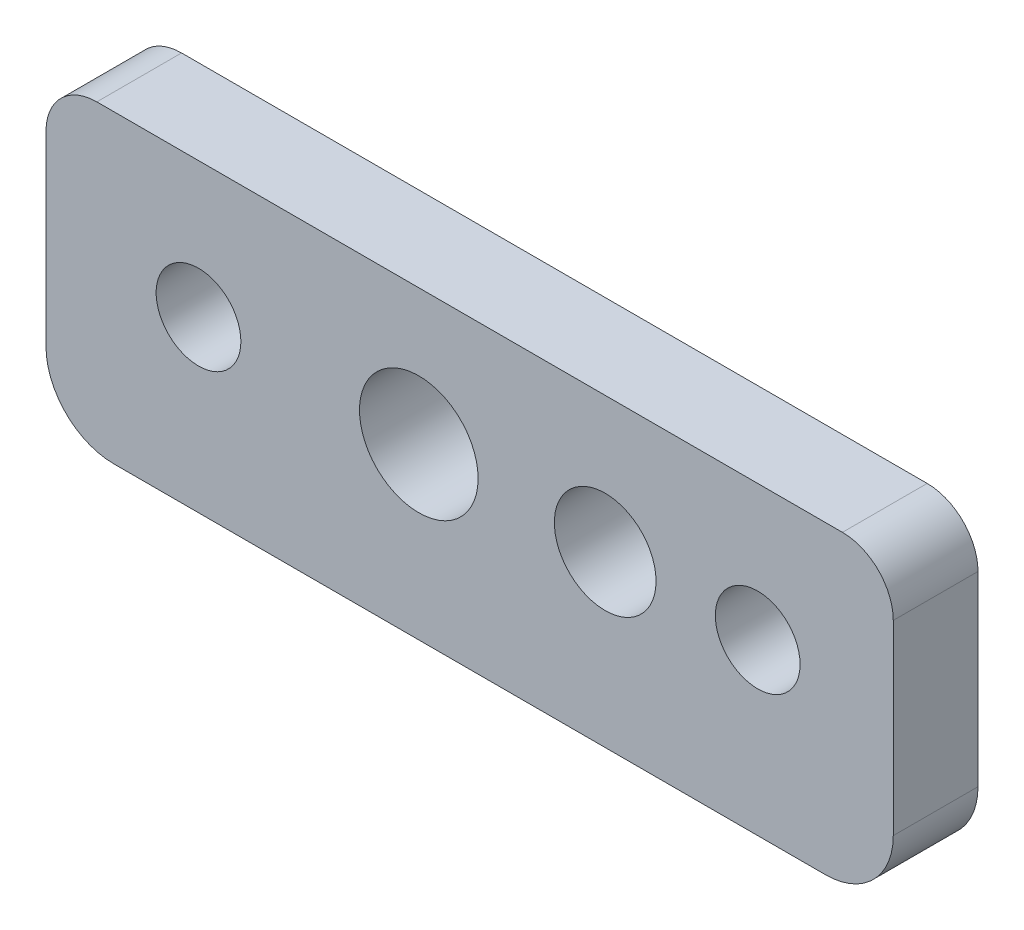
ISO-10303-21;
HEADER;
FILE_DESCRIPTION(('STEP AP214'),'2;1');
FILE_NAME('part.step','',(''),(''),'','','');
FILE_SCHEMA(('AUTOMOTIVE_DESIGN { 1 0 10303 214 1 1 1 1 }'));
ENDSEC;
DATA;
#1=APPLICATION_CONTEXT('core data for automotive mechanical design processes');
#2=APPLICATION_PROTOCOL_DEFINITION('international standard','automotive_design',2000,#1);
#3=PRODUCT_CONTEXT('',#1,'mechanical');
#4=PRODUCT('Part','Part','',(#3));
#5=PRODUCT_RELATED_PRODUCT_CATEGORY('part','',(#4));
#6=PRODUCT_DEFINITION_FORMATION('','',#4);
#7=PRODUCT_DEFINITION_CONTEXT('part definition',#1,'design');
#8=PRODUCT_DEFINITION('design','',#6,#7);
#9=PRODUCT_DEFINITION_SHAPE('','',#8);
#10=(LENGTH_UNIT() NAMED_UNIT(*) SI_UNIT(.MILLI.,.METRE.));
#11=(NAMED_UNIT(*) PLANE_ANGLE_UNIT() SI_UNIT($,.RADIAN.));
#12=(NAMED_UNIT(*) SI_UNIT($,.STERADIAN.) SOLID_ANGLE_UNIT());
#13=UNCERTAINTY_MEASURE_WITH_UNIT(LENGTH_MEASURE(1.E-05),#10,'distance_accuracy_value','');
#14=(GEOMETRIC_REPRESENTATION_CONTEXT(3) GLOBAL_UNCERTAINTY_ASSIGNED_CONTEXT((#13)) GLOBAL_UNIT_ASSIGNED_CONTEXT((#10,
#11,#12)) REPRESENTATION_CONTEXT('',''));
#15=CARTESIAN_POINT('',(0.,0.,0.));
#16=DIRECTION('',(0.,0.,1.));
#17=DIRECTION('',(1.,0.,0.));
#18=AXIS2_PLACEMENT_3D('',#15,#16,#17);
#19=CARTESIAN_POINT('',(0.,0.,25.));
#20=DIRECTION('',(-1.,0.,0.));
#21=DIRECTION('',(0.,0.,1.));
#22=AXIS2_PLACEMENT_3D('',#19,#20,#21);
#23=PLANE('',#22);
#24=DIRECTION('',(0.,1.,0.));
#25=VECTOR('',#24,1.);
#26=CARTESIAN_POINT('',(0.,0.,0.));
#27=LINE('',#26,#25);
#28=CARTESIAN_POINT('',(0.,-70.,0.));
#29=VERTEX_POINT('',#28);
#30=CARTESIAN_POINT('',(0.,-15.,0.));
#31=VERTEX_POINT('',#30);
#32=EDGE_CURVE('E112',#29,#31,#27,.T.);
#33=ORIENTED_EDGE('',*,*,#32,.F.);
#34=DIRECTION('',(0.,0.,-1.));
#35=VECTOR('',#34,1.);
#36=CARTESIAN_POINT('',(0.,-70.,25.));
#37=LINE('',#36,#35);
#38=CARTESIAN_POINT('',(0.,-70.,25.));
#39=VERTEX_POINT('',#38);
#40=EDGE_CURVE('E62',#29,#39,#37,.F.);
#41=ORIENTED_EDGE('',*,*,#40,.T.);
#42=DIRECTION('',(0.,1.,0.));
#43=VECTOR('',#42,1.);
#44=CARTESIAN_POINT('',(0.,0.,25.));
#45=LINE('',#44,#43);
#46=CARTESIAN_POINT('',(0.,-15.,25.));
#47=VERTEX_POINT('',#46);
#48=EDGE_CURVE('E163',#39,#47,#45,.T.);
#49=ORIENTED_EDGE('',*,*,#48,.T.);
#50=DIRECTION('',(0.,0.,-1.));
#51=VECTOR('',#50,1.);
#52=CARTESIAN_POINT('',(0.,-15.,25.));
#53=LINE('',#52,#51);
#54=EDGE_CURVE('E147',#47,#31,#53,.T.);
#55=ORIENTED_EDGE('',*,*,#54,.T.);
#56=EDGE_LOOP('',(#33,#41,#49,#55));
#57=FACE_BOUND('',#56,.T.);
#58=ADVANCED_FACE('F39',(#57),#23,.T.);
#59=CARTESIAN_POINT('',(0.,-90.,25.));
#60=DIRECTION('',(0.,-1.,0.));
#61=DIRECTION('',(1.,0.,0.));
#62=AXIS2_PLACEMENT_3D('',#59,#60,#61);
#63=PLANE('',#62);
#64=DIRECTION('',(-1.,0.,0.));
#65=VECTOR('',#64,1.);
#66=CARTESIAN_POINT('',(0.,-90.,25.));
#67=LINE('',#66,#65);
#68=CARTESIAN_POINT('',(230.,-90.,25.));
#69=VERTEX_POINT('',#68);
#70=CARTESIAN_POINT('',(20.,-90.,25.));
#71=VERTEX_POINT('',#70);
#72=EDGE_CURVE('E162',#69,#71,#67,.T.);
#73=ORIENTED_EDGE('',*,*,#72,.T.);
#74=DIRECTION('',(0.,0.,-1.));
#75=VECTOR('',#74,1.);
#76=CARTESIAN_POINT('',(20.,-90.,25.));
#77=LINE('',#76,#75);
#78=CARTESIAN_POINT('',(20.,-90.,0.));
#79=VERTEX_POINT('',#78);
#80=EDGE_CURVE('E151',#71,#79,#77,.T.);
#81=ORIENTED_EDGE('',*,*,#80,.T.);
#82=DIRECTION('',(-1.,0.,0.));
#83=VECTOR('',#82,1.);
#84=CARTESIAN_POINT('',(0.,-90.,0.));
#85=LINE('',#84,#83);
#86=CARTESIAN_POINT('',(230.,-90.,0.));
#87=VERTEX_POINT('',#86);
#88=EDGE_CURVE('E172',#87,#79,#85,.T.);
#89=ORIENTED_EDGE('',*,*,#88,.F.);
#90=DIRECTION('',(0.,0.,-1.));
#91=VECTOR('',#90,1.);
#92=CARTESIAN_POINT('',(230.,-90.,25.));
#93=LINE('',#92,#91);
#94=EDGE_CURVE('E149',#87,#69,#93,.F.);
#95=ORIENTED_EDGE('',*,*,#94,.T.);
#96=EDGE_LOOP('',(#73,#81,#89,#95));
#97=FACE_BOUND('',#96,.T.);
#98=ADVANCED_FACE('F167',(#97),#63,.T.);
#99=CARTESIAN_POINT('',(250.,0.,25.));
#100=DIRECTION('',(1.,0.,0.));
#101=DIRECTION('',(0.,0.,-1.));
#102=AXIS2_PLACEMENT_3D('',#99,#100,#101);
#103=PLANE('',#102);
#104=DIRECTION('',(0.,-1.,0.));
#105=VECTOR('',#104,1.);
#106=CARTESIAN_POINT('',(250.,0.,25.));
#107=LINE('',#106,#105);
#108=CARTESIAN_POINT('',(250.,-15.,25.));
#109=VERTEX_POINT('',#108);
#110=CARTESIAN_POINT('',(250.,-70.,25.));
#111=VERTEX_POINT('',#110);
#112=EDGE_CURVE('E137',#109,#111,#107,.T.);
#113=ORIENTED_EDGE('',*,*,#112,.T.);
#114=DIRECTION('',(0.,0.,-1.));
#115=VECTOR('',#114,1.);
#116=CARTESIAN_POINT('',(250.,-70.,25.));
#117=LINE('',#116,#115);
#118=CARTESIAN_POINT('',(250.,-70.,0.));
#119=VERTEX_POINT('',#118);
#120=EDGE_CURVE('E11',#111,#119,#117,.T.);
#121=ORIENTED_EDGE('',*,*,#120,.T.);
#122=DIRECTION('',(0.,-1.,0.));
#123=VECTOR('',#122,1.);
#124=CARTESIAN_POINT('',(250.,0.,0.));
#125=LINE('',#124,#123);
#126=CARTESIAN_POINT('',(250.,-15.,0.));
#127=VERTEX_POINT('',#126);
#128=EDGE_CURVE('E128',#127,#119,#125,.T.);
#129=ORIENTED_EDGE('',*,*,#128,.F.);
#130=DIRECTION('',(0.,0.,-1.));
#131=VECTOR('',#130,1.);
#132=CARTESIAN_POINT('',(250.,-15.,25.));
#133=LINE('',#132,#131);
#134=EDGE_CURVE('E142',#127,#109,#133,.F.);
#135=ORIENTED_EDGE('',*,*,#134,.T.);
#136=EDGE_LOOP('',(#113,#121,#129,#135));
#137=FACE_BOUND('',#136,.T.);
#138=ADVANCED_FACE('F184',(#137),#103,.T.);
#139=CARTESIAN_POINT('',(210.,-40.,25.));
#140=DIRECTION('',(0.,0.,-1.));
#141=DIRECTION('',(-1.,0.,0.));
#142=AXIS2_PLACEMENT_3D('',#139,#140,#141);
#143=CYLINDRICAL_SURFACE('',#142,12.5);
#144=CARTESIAN_POINT('',(210.,-40.,25.));
#145=DIRECTION('',(0.,0.,1.));
#146=DIRECTION('',(1.,0.,0.));
#147=AXIS2_PLACEMENT_3D('',#144,#145,#146);
#148=CIRCLE('',#147,12.5);
#149=CARTESIAN_POINT('',(222.5,-40.,25.));
#150=VERTEX_POINT('',#149);
#151=EDGE_CURVE('E248',#150,#150,#148,.T.);
#152=ORIENTED_EDGE('',*,*,#151,.T.);
#153=EDGE_LOOP('',(#152));
#154=FACE_BOUND('',#153,.T.);
#155=CARTESIAN_POINT('',(210.,-40.,0.));
#156=DIRECTION('',(0.,0.,1.));
#157=DIRECTION('',(1.,0.,0.));
#158=AXIS2_PLACEMENT_3D('',#155,#156,#157);
#159=CIRCLE('',#158,12.5);
#160=CARTESIAN_POINT('',(222.5,-40.,0.));
#161=VERTEX_POINT('',#160);
#162=EDGE_CURVE('E173',#161,#161,#159,.T.);
#163=ORIENTED_EDGE('',*,*,#162,.F.);
#164=EDGE_LOOP('',(#163));
#165=FACE_BOUND('',#164,.T.);
#166=ADVANCED_FACE('F205',(#154,#165),#143,.F.);
#167=CARTESIAN_POINT('',(165.,-40.,25.));
#168=DIRECTION('',(0.,0.,-1.));
#169=DIRECTION('',(-1.,0.,0.));
#170=AXIS2_PLACEMENT_3D('',#167,#168,#169);
#171=CYLINDRICAL_SURFACE('',#170,15.);
#172=CARTESIAN_POINT('',(165.,-40.,25.));
#173=DIRECTION('',(0.,0.,1.));
#174=DIRECTION('',(1.,0.,0.));
#175=AXIS2_PLACEMENT_3D('',#172,#173,#174);
#176=CIRCLE('',#175,15.);
#177=CARTESIAN_POINT('',(180.,-40.,25.));
#178=VERTEX_POINT('',#177);
#179=EDGE_CURVE('E245',#178,#178,#176,.T.);
#180=ORIENTED_EDGE('',*,*,#179,.T.);
#181=EDGE_LOOP('',(#180));
#182=FACE_BOUND('',#181,.T.);
#183=CARTESIAN_POINT('',(165.,-40.,0.));
#184=DIRECTION('',(0.,0.,1.));
#185=DIRECTION('',(1.,0.,0.));
#186=AXIS2_PLACEMENT_3D('',#183,#184,#185);
#187=CIRCLE('',#186,15.);
#188=CARTESIAN_POINT('',(180.,-40.,0.));
#189=VERTEX_POINT('',#188);
#190=EDGE_CURVE('E177',#189,#189,#187,.T.);
#191=ORIENTED_EDGE('',*,*,#190,.F.);
#192=EDGE_LOOP('',(#191));
#193=FACE_BOUND('',#192,.T.);
#194=ADVANCED_FACE('F202',(#182,#193),#171,.F.);
#195=CARTESIAN_POINT('',(110.,-40.,25.));
#196=DIRECTION('',(0.,0.,-1.));
#197=DIRECTION('',(-1.,0.,0.));
#198=AXIS2_PLACEMENT_3D('',#195,#196,#197);
#199=CYLINDRICAL_SURFACE('',#198,17.5);
#200=CARTESIAN_POINT('',(110.,-40.,25.));
#201=DIRECTION('',(0.,0.,1.));
#202=DIRECTION('',(1.,0.,0.));
#203=AXIS2_PLACEMENT_3D('',#200,#201,#202);
#204=CIRCLE('',#203,17.5);
#205=CARTESIAN_POINT('',(127.5,-40.,25.));
#206=VERTEX_POINT('',#205);
#207=EDGE_CURVE('E242',#206,#206,#204,.T.);
#208=ORIENTED_EDGE('',*,*,#207,.T.);
#209=EDGE_LOOP('',(#208));
#210=FACE_BOUND('',#209,.T.);
#211=CARTESIAN_POINT('',(110.,-40.,0.));
#212=DIRECTION('',(0.,0.,1.));
#213=DIRECTION('',(1.,0.,0.));
#214=AXIS2_PLACEMENT_3D('',#211,#212,#213);
#215=CIRCLE('',#214,17.5);
#216=CARTESIAN_POINT('',(127.5,-40.,0.));
#217=VERTEX_POINT('',#216);
#218=EDGE_CURVE('E195',#217,#217,#215,.T.);
#219=ORIENTED_EDGE('',*,*,#218,.F.);
#220=EDGE_LOOP('',(#219));
#221=FACE_BOUND('',#220,.T.);
#222=ADVANCED_FACE('F204',(#210,#221),#199,.F.);
#223=CARTESIAN_POINT('',(45.,-40.,25.));
#224=DIRECTION('',(0.,0.,-1.));
#225=DIRECTION('',(-1.,0.,0.));
#226=AXIS2_PLACEMENT_3D('',#223,#224,#225);
#227=CYLINDRICAL_SURFACE('',#226,12.5);
#228=CARTESIAN_POINT('',(45.,-40.,25.));
#229=DIRECTION('',(0.,0.,1.));
#230=DIRECTION('',(1.,0.,0.));
#231=AXIS2_PLACEMENT_3D('',#228,#229,#230);
#232=CIRCLE('',#231,12.5);
#233=CARTESIAN_POINT('',(57.5,-40.,25.));
#234=VERTEX_POINT('',#233);
#235=EDGE_CURVE('E127',#234,#234,#232,.T.);
#236=ORIENTED_EDGE('',*,*,#235,.T.);
#237=EDGE_LOOP('',(#236));
#238=FACE_BOUND('',#237,.T.);
#239=CARTESIAN_POINT('',(45.,-40.,0.));
#240=DIRECTION('',(0.,0.,1.));
#241=DIRECTION('',(1.,0.,0.));
#242=AXIS2_PLACEMENT_3D('',#239,#240,#241);
#243=CIRCLE('',#242,12.5);
#244=CARTESIAN_POINT('',(57.5,-40.,0.));
#245=VERTEX_POINT('',#244);
#246=EDGE_CURVE('E192',#245,#245,#243,.T.);
#247=ORIENTED_EDGE('',*,*,#246,.F.);
#248=EDGE_LOOP('',(#247));
#249=FACE_BOUND('',#248,.T.);
#250=ADVANCED_FACE('F212',(#238,#249),#227,.F.);
#251=CARTESIAN_POINT('',(0.,0.,25.));
#252=DIRECTION('',(0.,1.,0.));
#253=DIRECTION('',(0.,0.,1.));
#254=AXIS2_PLACEMENT_3D('',#251,#252,#253);
#255=PLANE('',#254);
#256=DIRECTION('',(1.,0.,0.));
#257=VECTOR('',#256,1.);
#258=CARTESIAN_POINT('',(0.,0.,25.));
#259=LINE('',#258,#257);
#260=CARTESIAN_POINT('',(15.,0.,25.));
#261=VERTEX_POINT('',#260);
#262=CARTESIAN_POINT('',(235.,0.,25.));
#263=VERTEX_POINT('',#262);
#264=EDGE_CURVE('E134',#261,#263,#259,.T.);
#265=ORIENTED_EDGE('',*,*,#264,.T.);
#266=DIRECTION('',(0.,0.,-1.));
#267=VECTOR('',#266,1.);
#268=CARTESIAN_POINT('',(235.,0.,25.));
#269=LINE('',#268,#267);
#270=CARTESIAN_POINT('',(235.,0.,0.));
#271=VERTEX_POINT('',#270);
#272=EDGE_CURVE('E118',#263,#271,#269,.T.);
#273=ORIENTED_EDGE('',*,*,#272,.T.);
#274=DIRECTION('',(1.,0.,0.));
#275=VECTOR('',#274,1.);
#276=CARTESIAN_POINT('',(0.,0.,0.));
#277=LINE('',#276,#275);
#278=CARTESIAN_POINT('',(15.,0.,0.));
#279=VERTEX_POINT('',#278);
#280=EDGE_CURVE('E111',#279,#271,#277,.T.);
#281=ORIENTED_EDGE('',*,*,#280,.F.);
#282=DIRECTION('',(0.,0.,-1.));
#283=VECTOR('',#282,1.);
#284=CARTESIAN_POINT('',(15.,0.,25.));
#285=LINE('',#284,#283);
#286=EDGE_CURVE('E124',#279,#261,#285,.F.);
#287=ORIENTED_EDGE('',*,*,#286,.T.);
#288=EDGE_LOOP('',(#265,#273,#281,#287));
#289=FACE_BOUND('',#288,.T.);
#290=ADVANCED_FACE('F123',(#289),#255,.T.);
#291=CARTESIAN_POINT('',(0.,0.,25.));
#292=DIRECTION('',(0.,0.,1.));
#293=DIRECTION('',(1.,0.,0.));
#294=AXIS2_PLACEMENT_3D('',#291,#292,#293);
#295=PLANE('',#294);
#296=ORIENTED_EDGE('',*,*,#235,.F.);
#297=EDGE_LOOP('',(#296));
#298=FACE_BOUND('',#297,.T.);
#299=ORIENTED_EDGE('',*,*,#207,.F.);
#300=EDGE_LOOP('',(#299));
#301=FACE_BOUND('',#300,.T.);
#302=ORIENTED_EDGE('',*,*,#179,.F.);
#303=EDGE_LOOP('',(#302));
#304=FACE_BOUND('',#303,.T.);
#305=ORIENTED_EDGE('',*,*,#151,.F.);
#306=EDGE_LOOP('',(#305));
#307=FACE_BOUND('',#306,.T.);
#308=ORIENTED_EDGE('',*,*,#48,.F.);
#309=CARTESIAN_POINT('',(20.,-70.,25.));
#310=DIRECTION('',(0.,0.,1.));
#311=DIRECTION('',(1.,0.,0.));
#312=AXIS2_PLACEMENT_3D('',#309,#310,#311);
#313=CIRCLE('',#312,20.);
#314=EDGE_CURVE('E47',#39,#71,#313,.T.);
#315=ORIENTED_EDGE('',*,*,#314,.T.);
#316=ORIENTED_EDGE('',*,*,#72,.F.);
#317=CARTESIAN_POINT('',(230.,-70.,25.));
#318=DIRECTION('',(0.,0.,1.));
#319=DIRECTION('',(1.,0.,0.));
#320=AXIS2_PLACEMENT_3D('',#317,#318,#319);
#321=CIRCLE('',#320,20.);
#322=EDGE_CURVE('E54',#69,#111,#321,.T.);
#323=ORIENTED_EDGE('',*,*,#322,.T.);
#324=ORIENTED_EDGE('',*,*,#112,.F.);
#325=CARTESIAN_POINT('',(235.,-15.,25.));
#326=DIRECTION('',(0.,0.,1.));
#327=DIRECTION('',(1.,0.,0.));
#328=AXIS2_PLACEMENT_3D('',#325,#326,#327);
#329=CIRCLE('',#328,15.);
#330=EDGE_CURVE('E145',#109,#263,#329,.T.);
#331=ORIENTED_EDGE('',*,*,#330,.T.);
#332=ORIENTED_EDGE('',*,*,#264,.F.);
#333=CARTESIAN_POINT('',(15.,-15.,25.));
#334=DIRECTION('',(0.,0.,1.));
#335=DIRECTION('',(1.,0.,0.));
#336=AXIS2_PLACEMENT_3D('',#333,#334,#335);
#337=CIRCLE('',#336,15.);
#338=EDGE_CURVE('E133',#261,#47,#337,.T.);
#339=ORIENTED_EDGE('',*,*,#338,.T.);
#340=EDGE_LOOP('',(#308,#315,#316,#323,#324,#331,#332,#339));
#341=FACE_BOUND('',#340,.T.);
#342=ADVANCED_FACE('F161',(#298,#301,#304,#307,#341),#295,.T.);
#343=CARTESIAN_POINT('',(0.,0.,0.));
#344=DIRECTION('',(0.,0.,1.));
#345=DIRECTION('',(1.,0.,0.));
#346=AXIS2_PLACEMENT_3D('',#343,#344,#345);
#347=PLANE('',#346);
#348=ORIENTED_EDGE('',*,*,#246,.T.);
#349=EDGE_LOOP('',(#348));
#350=FACE_BOUND('',#349,.T.);
#351=ORIENTED_EDGE('',*,*,#218,.T.);
#352=EDGE_LOOP('',(#351));
#353=FACE_BOUND('',#352,.T.);
#354=ORIENTED_EDGE('',*,*,#190,.T.);
#355=EDGE_LOOP('',(#354));
#356=FACE_BOUND('',#355,.T.);
#357=ORIENTED_EDGE('',*,*,#162,.T.);
#358=EDGE_LOOP('',(#357));
#359=FACE_BOUND('',#358,.T.);
#360=ORIENTED_EDGE('',*,*,#88,.T.);
#361=CARTESIAN_POINT('',(20.,-70.,0.));
#362=DIRECTION('',(0.,0.,1.));
#363=DIRECTION('',(1.,0.,0.));
#364=AXIS2_PLACEMENT_3D('',#361,#362,#363);
#365=CIRCLE('',#364,20.);
#366=EDGE_CURVE('E156',#79,#29,#365,.F.);
#367=ORIENTED_EDGE('',*,*,#366,.T.);
#368=ORIENTED_EDGE('',*,*,#32,.T.);
#369=CARTESIAN_POINT('',(15.,-15.,0.));
#370=DIRECTION('',(0.,0.,1.));
#371=DIRECTION('',(1.,0.,0.));
#372=AXIS2_PLACEMENT_3D('',#369,#370,#371);
#373=CIRCLE('',#372,15.);
#374=EDGE_CURVE('E107',#31,#279,#373,.F.);
#375=ORIENTED_EDGE('',*,*,#374,.T.);
#376=ORIENTED_EDGE('',*,*,#280,.T.);
#377=CARTESIAN_POINT('',(235.,-15.,0.));
#378=DIRECTION('',(0.,0.,1.));
#379=DIRECTION('',(1.,0.,0.));
#380=AXIS2_PLACEMENT_3D('',#377,#378,#379);
#381=CIRCLE('',#380,15.);
#382=EDGE_CURVE('E117',#271,#127,#381,.F.);
#383=ORIENTED_EDGE('',*,*,#382,.T.);
#384=ORIENTED_EDGE('',*,*,#128,.T.);
#385=CARTESIAN_POINT('',(230.,-70.,0.));
#386=DIRECTION('',(0.,0.,1.));
#387=DIRECTION('',(1.,0.,0.));
#388=AXIS2_PLACEMENT_3D('',#385,#386,#387);
#389=CIRCLE('',#388,20.);
#390=EDGE_CURVE('E154',#119,#87,#389,.F.);
#391=ORIENTED_EDGE('',*,*,#390,.T.);
#392=EDGE_LOOP('',(#360,#367,#368,#375,#376,#383,#384,#391));
#393=FACE_BOUND('',#392,.T.);
#394=ADVANCED_FACE('F110',(#350,#353,#356,#359,#393),#347,.F.);
#395=CARTESIAN_POINT('',(235.,-15.,25.));
#396=DIRECTION('',(0.,0.,-1.));
#397=DIRECTION('',(-1.,0.,0.));
#398=AXIS2_PLACEMENT_3D('',#395,#396,#397);
#399=CYLINDRICAL_SURFACE('',#398,15.);
#400=ORIENTED_EDGE('',*,*,#330,.F.);
#401=ORIENTED_EDGE('',*,*,#134,.F.);
#402=ORIENTED_EDGE('',*,*,#382,.F.);
#403=ORIENTED_EDGE('',*,*,#272,.F.);
#404=EDGE_LOOP('',(#400,#401,#402,#403));
#405=FACE_BOUND('',#404,.T.);
#406=ADVANCED_FACE('F188',(#405),#399,.T.);
#407=CARTESIAN_POINT('',(15.,-15.,25.));
#408=DIRECTION('',(0.,0.,-1.));
#409=DIRECTION('',(-1.,0.,0.));
#410=AXIS2_PLACEMENT_3D('',#407,#408,#409);
#411=CYLINDRICAL_SURFACE('',#410,15.);
#412=ORIENTED_EDGE('',*,*,#338,.F.);
#413=ORIENTED_EDGE('',*,*,#286,.F.);
#414=ORIENTED_EDGE('',*,*,#374,.F.);
#415=ORIENTED_EDGE('',*,*,#54,.F.);
#416=EDGE_LOOP('',(#412,#413,#414,#415));
#417=FACE_BOUND('',#416,.T.);
#418=ADVANCED_FACE('F131',(#417),#411,.T.);
#419=CARTESIAN_POINT('',(20.,-70.,25.));
#420=DIRECTION('',(0.,0.,-1.));
#421=DIRECTION('',(-1.,0.,0.));
#422=AXIS2_PLACEMENT_3D('',#419,#420,#421);
#423=CYLINDRICAL_SURFACE('',#422,20.);
#424=ORIENTED_EDGE('',*,*,#314,.F.);
#425=ORIENTED_EDGE('',*,*,#40,.F.);
#426=ORIENTED_EDGE('',*,*,#366,.F.);
#427=ORIENTED_EDGE('',*,*,#80,.F.);
#428=EDGE_LOOP('',(#424,#425,#426,#427));
#429=FACE_BOUND('',#428,.T.);
#430=ADVANCED_FACE('F171',(#429),#423,.T.);
#431=CARTESIAN_POINT('',(230.,-70.,25.));
#432=DIRECTION('',(0.,0.,-1.));
#433=DIRECTION('',(-1.,0.,0.));
#434=AXIS2_PLACEMENT_3D('',#431,#432,#433);
#435=CYLINDRICAL_SURFACE('',#434,20.);
#436=ORIENTED_EDGE('',*,*,#322,.F.);
#437=ORIENTED_EDGE('',*,*,#94,.F.);
#438=ORIENTED_EDGE('',*,*,#390,.F.);
#439=ORIENTED_EDGE('',*,*,#120,.F.);
#440=EDGE_LOOP('',(#436,#437,#438,#439));
#441=FACE_BOUND('',#440,.T.);
#442=ADVANCED_FACE('F41',(#441),#435,.T.);
#443=CLOSED_SHELL('',(#58,#98,#138,#166,#194,#222,#250,#290,#342,#394,#406,#418,#430,#442));
#444=MANIFOLD_SOLID_BREP('B2',#443);
#445=ADVANCED_BREP_SHAPE_REPRESENTATION('',(#18,#444),#14);
#446=SHAPE_DEFINITION_REPRESENTATION(#9,#445);
ENDSEC;
END-ISO-10303-21;
